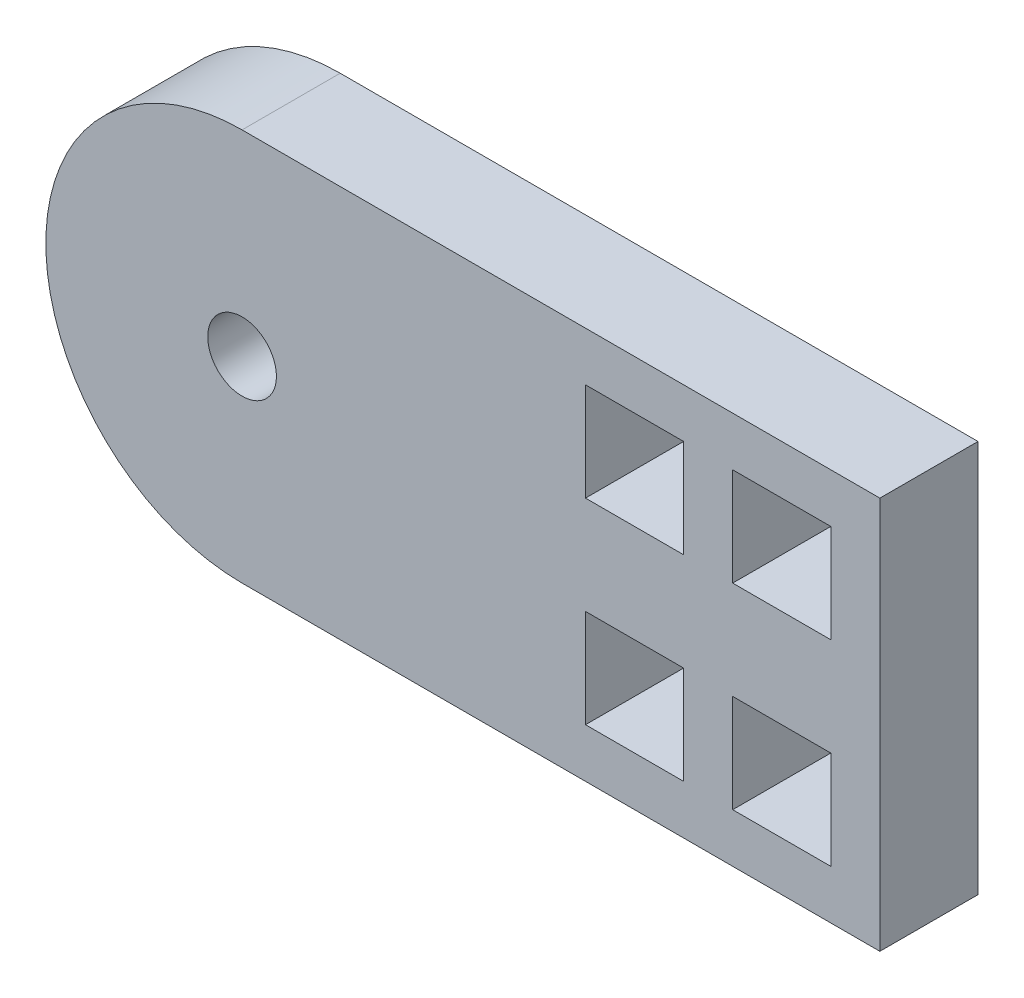
ISO-10303-21;
HEADER;
FILE_DESCRIPTION(('STEP AP214'),'2;1');
FILE_NAME('part.step','',(''),(''),'','','');
FILE_SCHEMA(('AUTOMOTIVE_DESIGN { 1 0 10303 214 1 1 1 1 }'));
ENDSEC;
DATA;
#1=APPLICATION_CONTEXT('core data for automotive mechanical design processes');
#2=APPLICATION_PROTOCOL_DEFINITION('international standard','automotive_design',2000,#1);
#3=PRODUCT_CONTEXT('',#1,'mechanical');
#4=PRODUCT('Part','Part','',(#3));
#5=PRODUCT_RELATED_PRODUCT_CATEGORY('part','',(#4));
#6=PRODUCT_DEFINITION_FORMATION('','',#4);
#7=PRODUCT_DEFINITION_CONTEXT('part definition',#1,'design');
#8=PRODUCT_DEFINITION('design','',#6,#7);
#9=PRODUCT_DEFINITION_SHAPE('','',#8);
#10=(LENGTH_UNIT() NAMED_UNIT(*) SI_UNIT(.MILLI.,.METRE.));
#11=(NAMED_UNIT(*) PLANE_ANGLE_UNIT() SI_UNIT($,.RADIAN.));
#12=(NAMED_UNIT(*) SI_UNIT($,.STERADIAN.) SOLID_ANGLE_UNIT());
#13=UNCERTAINTY_MEASURE_WITH_UNIT(LENGTH_MEASURE(1.E-05),#10,'distance_accuracy_value','');
#14=(GEOMETRIC_REPRESENTATION_CONTEXT(3) GLOBAL_UNCERTAINTY_ASSIGNED_CONTEXT((#13)) GLOBAL_UNIT_ASSIGNED_CONTEXT((#10,
#11,#12)) REPRESENTATION_CONTEXT('',''));
#15=CARTESIAN_POINT('',(0.,0.,0.));
#16=DIRECTION('',(0.,0.,1.));
#17=DIRECTION('',(1.,0.,0.));
#18=AXIS2_PLACEMENT_3D('',#15,#16,#17);
#19=CARTESIAN_POINT('',(0.,0.,5.));
#20=DIRECTION('',(0.,0.,1.));
#21=DIRECTION('',(1.,0.,0.));
#22=AXIS2_PLACEMENT_3D('',#19,#20,#21);
#23=PLANE('',#22);
#24=CARTESIAN_POINT('',(0.,0.,5.));
#25=DIRECTION('',(0.,0.,1.));
#26=DIRECTION('',(1.,0.,0.));
#27=AXIS2_PLACEMENT_3D('',#24,#25,#26);
#28=CIRCLE('',#27,10.);
#29=CARTESIAN_POINT('',(0.,10.,5.));
#30=VERTEX_POINT('',#29);
#31=CARTESIAN_POINT('',(0.,-10.,5.));
#32=VERTEX_POINT('',#31);
#33=EDGE_CURVE('E307',#30,#32,#28,.T.);
#34=ORIENTED_EDGE('',*,*,#33,.T.);
#35=DIRECTION('',(1.,0.,0.));
#36=VECTOR('',#35,1.);
#37=CARTESIAN_POINT('',(0.,-10.,5.));
#38=LINE('',#37,#36);
#39=CARTESIAN_POINT('',(32.5,-10.,5.));
#40=VERTEX_POINT('',#39);
#41=EDGE_CURVE('E310',#32,#40,#38,.T.);
#42=ORIENTED_EDGE('',*,*,#41,.T.);
#43=DIRECTION('',(0.,1.,0.));
#44=VECTOR('',#43,1.);
#45=CARTESIAN_POINT('',(32.5,10.,5.));
#46=LINE('',#45,#44);
#47=CARTESIAN_POINT('',(32.5,10.,5.));
#48=VERTEX_POINT('',#47);
#49=EDGE_CURVE('E313',#40,#48,#46,.T.);
#50=ORIENTED_EDGE('',*,*,#49,.T.);
#51=DIRECTION('',(-1.,0.,0.));
#52=VECTOR('',#51,1.);
#53=CARTESIAN_POINT('',(0.,10.,5.));
#54=LINE('',#53,#52);
#55=EDGE_CURVE('E315',#48,#30,#54,.T.);
#56=ORIENTED_EDGE('',*,*,#55,.T.);
#57=EDGE_LOOP('',(#34,#42,#50,#56));
#58=FACE_BOUND('',#57,.T.);
#59=CARTESIAN_POINT('',(0.,0.,5.));
#60=DIRECTION('',(0.,0.,1.));
#61=DIRECTION('',(1.,0.,0.));
#62=AXIS2_PLACEMENT_3D('',#59,#60,#61);
#63=CIRCLE('',#62,1.75);
#64=CARTESIAN_POINT('',(1.75,0.,5.));
#65=VERTEX_POINT('',#64);
#66=EDGE_CURVE('E301',#65,#65,#63,.T.);
#67=ORIENTED_EDGE('',*,*,#66,.F.);
#68=EDGE_LOOP('',(#67));
#69=FACE_BOUND('',#68,.T.);
#70=DIRECTION('',(-1.,0.,0.));
#71=VECTOR('',#70,1.);
#72=CARTESIAN_POINT('',(25.,7.5,5.));
#73=LINE('',#72,#71);
#74=CARTESIAN_POINT('',(30.,7.5,5.));
#75=VERTEX_POINT('',#74);
#76=CARTESIAN_POINT('',(25.,7.5,5.));
#77=VERTEX_POINT('',#76);
#78=EDGE_CURVE('E272',#75,#77,#73,.T.);
#79=ORIENTED_EDGE('',*,*,#78,.F.);
#80=DIRECTION('',(0.,1.,0.));
#81=VECTOR('',#80,1.);
#82=CARTESIAN_POINT('',(30.,7.5,5.));
#83=LINE('',#82,#81);
#84=CARTESIAN_POINT('',(30.,2.5,5.));
#85=VERTEX_POINT('',#84);
#86=EDGE_CURVE('E270',#85,#75,#83,.T.);
#87=ORIENTED_EDGE('',*,*,#86,.F.);
#88=DIRECTION('',(1.,0.,0.));
#89=VECTOR('',#88,1.);
#90=CARTESIAN_POINT('',(25.,2.5,5.));
#91=LINE('',#90,#89);
#92=CARTESIAN_POINT('',(25.,2.5,5.));
#93=VERTEX_POINT('',#92);
#94=EDGE_CURVE('E278',#93,#85,#91,.T.);
#95=ORIENTED_EDGE('',*,*,#94,.F.);
#96=DIRECTION('',(0.,-1.,0.));
#97=VECTOR('',#96,1.);
#98=CARTESIAN_POINT('',(25.,7.5,5.));
#99=LINE('',#98,#97);
#100=EDGE_CURVE('E275',#77,#93,#99,.T.);
#101=ORIENTED_EDGE('',*,*,#100,.F.);
#102=EDGE_LOOP('',(#79,#87,#95,#101));
#103=FACE_BOUND('',#102,.T.);
#104=DIRECTION('',(-1.,0.,0.));
#105=VECTOR('',#104,1.);
#106=CARTESIAN_POINT('',(25.,-2.5,5.));
#107=LINE('',#106,#105);
#108=CARTESIAN_POINT('',(30.,-2.5,5.));
#109=VERTEX_POINT('',#108);
#110=CARTESIAN_POINT('',(25.,-2.5,5.));
#111=VERTEX_POINT('',#110);
#112=EDGE_CURVE('E241',#109,#111,#107,.T.);
#113=ORIENTED_EDGE('',*,*,#112,.F.);
#114=DIRECTION('',(0.,1.,0.));
#115=VECTOR('',#114,1.);
#116=CARTESIAN_POINT('',(30.,-2.5,5.));
#117=LINE('',#116,#115);
#118=CARTESIAN_POINT('',(30.,-7.5,5.));
#119=VERTEX_POINT('',#118);
#120=EDGE_CURVE('E239',#119,#109,#117,.T.);
#121=ORIENTED_EDGE('',*,*,#120,.F.);
#122=DIRECTION('',(1.,0.,0.));
#123=VECTOR('',#122,1.);
#124=CARTESIAN_POINT('',(25.,-7.5,5.));
#125=LINE('',#124,#123);
#126=CARTESIAN_POINT('',(25.,-7.5,5.));
#127=VERTEX_POINT('',#126);
#128=EDGE_CURVE('E247',#127,#119,#125,.T.);
#129=ORIENTED_EDGE('',*,*,#128,.F.);
#130=DIRECTION('',(0.,-1.,0.));
#131=VECTOR('',#130,1.);
#132=CARTESIAN_POINT('',(25.,-2.5,5.));
#133=LINE('',#132,#131);
#134=EDGE_CURVE('E244',#111,#127,#133,.T.);
#135=ORIENTED_EDGE('',*,*,#134,.F.);
#136=EDGE_LOOP('',(#113,#121,#129,#135));
#137=FACE_BOUND('',#136,.T.);
#138=DIRECTION('',(-1.,0.,0.));
#139=VECTOR('',#138,1.);
#140=CARTESIAN_POINT('',(17.5,-2.5,5.));
#141=LINE('',#140,#139);
#142=CARTESIAN_POINT('',(22.5,-2.5,5.));
#143=VERTEX_POINT('',#142);
#144=CARTESIAN_POINT('',(17.5,-2.5,5.));
#145=VERTEX_POINT('',#144);
#146=EDGE_CURVE('E210',#143,#145,#141,.T.);
#147=ORIENTED_EDGE('',*,*,#146,.F.);
#148=DIRECTION('',(0.,1.,0.));
#149=VECTOR('',#148,1.);
#150=CARTESIAN_POINT('',(22.5,-2.5,5.));
#151=LINE('',#150,#149);
#152=CARTESIAN_POINT('',(22.5,-7.5,5.));
#153=VERTEX_POINT('',#152);
#154=EDGE_CURVE('E208',#153,#143,#151,.T.);
#155=ORIENTED_EDGE('',*,*,#154,.F.);
#156=DIRECTION('',(1.,0.,0.));
#157=VECTOR('',#156,1.);
#158=CARTESIAN_POINT('',(17.5,-7.5,5.));
#159=LINE('',#158,#157);
#160=CARTESIAN_POINT('',(17.5,-7.5,5.));
#161=VERTEX_POINT('',#160);
#162=EDGE_CURVE('E216',#161,#153,#159,.T.);
#163=ORIENTED_EDGE('',*,*,#162,.F.);
#164=DIRECTION('',(0.,-1.,0.));
#165=VECTOR('',#164,1.);
#166=CARTESIAN_POINT('',(17.5,-2.5,5.));
#167=LINE('',#166,#165);
#168=EDGE_CURVE('E213',#145,#161,#167,.T.);
#169=ORIENTED_EDGE('',*,*,#168,.F.);
#170=EDGE_LOOP('',(#147,#155,#163,#169));
#171=FACE_BOUND('',#170,.T.);
#172=DIRECTION('',(-1.,0.,0.));
#173=VECTOR('',#172,1.);
#174=CARTESIAN_POINT('',(17.5,7.5,5.));
#175=LINE('',#174,#173);
#176=CARTESIAN_POINT('',(22.5,7.5,5.));
#177=VERTEX_POINT('',#176);
#178=CARTESIAN_POINT('',(17.5,7.5,5.));
#179=VERTEX_POINT('',#178);
#180=EDGE_CURVE('E180',#177,#179,#175,.T.);
#181=ORIENTED_EDGE('',*,*,#180,.F.);
#182=DIRECTION('',(0.,1.,0.));
#183=VECTOR('',#182,1.);
#184=CARTESIAN_POINT('',(22.5,7.5,5.));
#185=LINE('',#184,#183);
#186=CARTESIAN_POINT('',(22.5,2.5,5.));
#187=VERTEX_POINT('',#186);
#188=EDGE_CURVE('E172',#187,#177,#185,.T.);
#189=ORIENTED_EDGE('',*,*,#188,.F.);
#190=DIRECTION('',(1.,0.,0.));
#191=VECTOR('',#190,1.);
#192=CARTESIAN_POINT('',(17.5,2.5,5.));
#193=LINE('',#192,#191);
#194=CARTESIAN_POINT('',(17.5,2.5,5.));
#195=VERTEX_POINT('',#194);
#196=EDGE_CURVE('E194',#195,#187,#193,.T.);
#197=ORIENTED_EDGE('',*,*,#196,.F.);
#198=DIRECTION('',(0.,-1.,0.));
#199=VECTOR('',#198,1.);
#200=CARTESIAN_POINT('',(17.5,7.5,5.));
#201=LINE('',#200,#199);
#202=EDGE_CURVE('E192',#179,#195,#201,.T.);
#203=ORIENTED_EDGE('',*,*,#202,.F.);
#204=EDGE_LOOP('',(#181,#189,#197,#203));
#205=FACE_BOUND('',#204,.T.);
#206=ADVANCED_FACE('F35',(#58,#69,#103,#137,#171,#205),#23,.T.);
#207=CARTESIAN_POINT('',(0.,0.,0.));
#208=DIRECTION('',(0.,0.,1.));
#209=DIRECTION('',(1.,0.,0.));
#210=AXIS2_PLACEMENT_3D('',#207,#208,#209);
#211=PLANE('',#210);
#212=DIRECTION('',(0.,1.,0.));
#213=VECTOR('',#212,1.);
#214=CARTESIAN_POINT('',(22.5,-2.5,0.));
#215=LINE('',#214,#213);
#216=CARTESIAN_POINT('',(22.5,-7.5,0.));
#217=VERTEX_POINT('',#216);
#218=CARTESIAN_POINT('',(22.5,-2.5,0.));
#219=VERTEX_POINT('',#218);
#220=EDGE_CURVE('E188',#217,#219,#215,.T.);
#221=ORIENTED_EDGE('',*,*,#220,.T.);
#222=DIRECTION('',(-1.,0.,0.));
#223=VECTOR('',#222,1.);
#224=CARTESIAN_POINT('',(17.5,-2.5,0.));
#225=LINE('',#224,#223);
#226=CARTESIAN_POINT('',(17.5,-2.5,0.));
#227=VERTEX_POINT('',#226);
#228=EDGE_CURVE('E221',#219,#227,#225,.T.);
#229=ORIENTED_EDGE('',*,*,#228,.T.);
#230=DIRECTION('',(0.,-1.,0.));
#231=VECTOR('',#230,1.);
#232=CARTESIAN_POINT('',(17.5,-2.5,0.));
#233=LINE('',#232,#231);
#234=CARTESIAN_POINT('',(17.5,-7.5,0.));
#235=VERTEX_POINT('',#234);
#236=EDGE_CURVE('E224',#227,#235,#233,.T.);
#237=ORIENTED_EDGE('',*,*,#236,.T.);
#238=DIRECTION('',(1.,0.,0.));
#239=VECTOR('',#238,1.);
#240=CARTESIAN_POINT('',(17.5,-7.5,0.));
#241=LINE('',#240,#239);
#242=EDGE_CURVE('E211',#235,#217,#241,.T.);
#243=ORIENTED_EDGE('',*,*,#242,.T.);
#244=EDGE_LOOP('',(#221,#229,#237,#243));
#245=FACE_BOUND('',#244,.T.);
#246=DIRECTION('',(0.,1.,0.));
#247=VECTOR('',#246,1.);
#248=CARTESIAN_POINT('',(30.,7.5,0.));
#249=LINE('',#248,#247);
#250=CARTESIAN_POINT('',(30.,2.5,0.));
#251=VERTEX_POINT('',#250);
#252=CARTESIAN_POINT('',(30.,7.5,0.));
#253=VERTEX_POINT('',#252);
#254=EDGE_CURVE('E269',#251,#253,#249,.T.);
#255=ORIENTED_EDGE('',*,*,#254,.T.);
#256=DIRECTION('',(-1.,0.,0.));
#257=VECTOR('',#256,1.);
#258=CARTESIAN_POINT('',(25.,7.5,0.));
#259=LINE('',#258,#257);
#260=CARTESIAN_POINT('',(25.,7.5,0.));
#261=VERTEX_POINT('',#260);
#262=EDGE_CURVE('E283',#253,#261,#259,.T.);
#263=ORIENTED_EDGE('',*,*,#262,.T.);
#264=DIRECTION('',(0.,-1.,0.));
#265=VECTOR('',#264,1.);
#266=CARTESIAN_POINT('',(25.,7.5,0.));
#267=LINE('',#266,#265);
#268=CARTESIAN_POINT('',(25.,2.5,0.));
#269=VERTEX_POINT('',#268);
#270=EDGE_CURVE('E286',#261,#269,#267,.T.);
#271=ORIENTED_EDGE('',*,*,#270,.T.);
#272=DIRECTION('',(1.,0.,0.));
#273=VECTOR('',#272,1.);
#274=CARTESIAN_POINT('',(25.,2.5,0.));
#275=LINE('',#274,#273);
#276=EDGE_CURVE('E273',#269,#251,#275,.T.);
#277=ORIENTED_EDGE('',*,*,#276,.T.);
#278=EDGE_LOOP('',(#255,#263,#271,#277));
#279=FACE_BOUND('',#278,.T.);
#280=CARTESIAN_POINT('',(0.,0.,0.));
#281=DIRECTION('',(0.,0.,1.));
#282=DIRECTION('',(1.,0.,0.));
#283=AXIS2_PLACEMENT_3D('',#280,#281,#282);
#284=CIRCLE('',#283,10.);
#285=CARTESIAN_POINT('',(0.,10.,0.));
#286=VERTEX_POINT('',#285);
#287=CARTESIAN_POINT('',(0.,-10.,0.));
#288=VERTEX_POINT('',#287);
#289=EDGE_CURVE('E304',#286,#288,#284,.T.);
#290=ORIENTED_EDGE('',*,*,#289,.F.);
#291=DIRECTION('',(-1.,0.,0.));
#292=VECTOR('',#291,1.);
#293=CARTESIAN_POINT('',(0.,10.,0.));
#294=LINE('',#293,#292);
#295=CARTESIAN_POINT('',(32.5,10.,0.));
#296=VERTEX_POINT('',#295);
#297=EDGE_CURVE('E311',#296,#286,#294,.T.);
#298=ORIENTED_EDGE('',*,*,#297,.F.);
#299=DIRECTION('',(0.,1.,0.));
#300=VECTOR('',#299,1.);
#301=CARTESIAN_POINT('',(32.5,10.,0.));
#302=LINE('',#301,#300);
#303=CARTESIAN_POINT('',(32.5,-10.,0.));
#304=VERTEX_POINT('',#303);
#305=EDGE_CURVE('E322',#304,#296,#302,.T.);
#306=ORIENTED_EDGE('',*,*,#305,.F.);
#307=DIRECTION('',(1.,0.,0.));
#308=VECTOR('',#307,1.);
#309=CARTESIAN_POINT('',(0.,-10.,0.));
#310=LINE('',#309,#308);
#311=EDGE_CURVE('E320',#288,#304,#310,.T.);
#312=ORIENTED_EDGE('',*,*,#311,.F.);
#313=EDGE_LOOP('',(#290,#298,#306,#312));
#314=FACE_BOUND('',#313,.T.);
#315=CARTESIAN_POINT('',(0.,0.,0.));
#316=DIRECTION('',(0.,0.,1.));
#317=DIRECTION('',(1.,0.,0.));
#318=AXIS2_PLACEMENT_3D('',#315,#316,#317);
#319=CIRCLE('',#318,1.75);
#320=CARTESIAN_POINT('',(1.75,0.,0.));
#321=VERTEX_POINT('',#320);
#322=EDGE_CURVE('E300',#321,#321,#319,.T.);
#323=ORIENTED_EDGE('',*,*,#322,.T.);
#324=EDGE_LOOP('',(#323));
#325=FACE_BOUND('',#324,.T.);
#326=DIRECTION('',(0.,1.,0.));
#327=VECTOR('',#326,1.);
#328=CARTESIAN_POINT('',(30.,-2.5,0.));
#329=LINE('',#328,#327);
#330=CARTESIAN_POINT('',(30.,-7.5,0.));
#331=VERTEX_POINT('',#330);
#332=CARTESIAN_POINT('',(30.,-2.5,0.));
#333=VERTEX_POINT('',#332);
#334=EDGE_CURVE('E238',#331,#333,#329,.T.);
#335=ORIENTED_EDGE('',*,*,#334,.T.);
#336=DIRECTION('',(-1.,0.,0.));
#337=VECTOR('',#336,1.);
#338=CARTESIAN_POINT('',(25.,-2.5,0.));
#339=LINE('',#338,#337);
#340=CARTESIAN_POINT('',(25.,-2.5,0.));
#341=VERTEX_POINT('',#340);
#342=EDGE_CURVE('E252',#333,#341,#339,.T.);
#343=ORIENTED_EDGE('',*,*,#342,.T.);
#344=DIRECTION('',(0.,-1.,0.));
#345=VECTOR('',#344,1.);
#346=CARTESIAN_POINT('',(25.,-2.5,0.));
#347=LINE('',#346,#345);
#348=CARTESIAN_POINT('',(25.,-7.5,0.));
#349=VERTEX_POINT('',#348);
#350=EDGE_CURVE('E255',#341,#349,#347,.T.);
#351=ORIENTED_EDGE('',*,*,#350,.T.);
#352=DIRECTION('',(1.,0.,0.));
#353=VECTOR('',#352,1.);
#354=CARTESIAN_POINT('',(25.,-7.5,0.));
#355=LINE('',#354,#353);
#356=EDGE_CURVE('E242',#349,#331,#355,.T.);
#357=ORIENTED_EDGE('',*,*,#356,.T.);
#358=EDGE_LOOP('',(#335,#343,#351,#357));
#359=FACE_BOUND('',#358,.T.);
#360=DIRECTION('',(0.,1.,0.));
#361=VECTOR('',#360,1.);
#362=CARTESIAN_POINT('',(22.5,7.5,0.));
#363=LINE('',#362,#361);
#364=CARTESIAN_POINT('',(22.5,2.5,0.));
#365=VERTEX_POINT('',#364);
#366=CARTESIAN_POINT('',(22.5,7.5,0.));
#367=VERTEX_POINT('',#366);
#368=EDGE_CURVE('E58',#365,#367,#363,.T.);
#369=ORIENTED_EDGE('',*,*,#368,.T.);
#370=DIRECTION('',(-1.,0.,0.));
#371=VECTOR('',#370,1.);
#372=CARTESIAN_POINT('',(17.5,7.5,0.));
#373=LINE('',#372,#371);
#374=CARTESIAN_POINT('',(17.5,7.5,0.));
#375=VERTEX_POINT('',#374);
#376=EDGE_CURVE('E187',#367,#375,#373,.T.);
#377=ORIENTED_EDGE('',*,*,#376,.T.);
#378=DIRECTION('',(0.,-1.,0.));
#379=VECTOR('',#378,1.);
#380=CARTESIAN_POINT('',(17.5,7.5,0.));
#381=LINE('',#380,#379);
#382=CARTESIAN_POINT('',(17.5,2.5,0.));
#383=VERTEX_POINT('',#382);
#384=EDGE_CURVE('E200',#375,#383,#381,.T.);
#385=ORIENTED_EDGE('',*,*,#384,.T.);
#386=DIRECTION('',(1.,0.,0.));
#387=VECTOR('',#386,1.);
#388=CARTESIAN_POINT('',(17.5,2.5,0.));
#389=LINE('',#388,#387);
#390=EDGE_CURVE('E181',#383,#365,#389,.T.);
#391=ORIENTED_EDGE('',*,*,#390,.T.);
#392=EDGE_LOOP('',(#369,#377,#385,#391));
#393=FACE_BOUND('',#392,.T.);
#394=ADVANCED_FACE('F340',(#245,#279,#314,#325,#359,#393),#211,.F.);
#395=CARTESIAN_POINT('',(0.,0.,5.));
#396=DIRECTION('',(0.,0.,-1.));
#397=DIRECTION('',(-1.,0.,0.));
#398=AXIS2_PLACEMENT_3D('',#395,#396,#397);
#399=CYLINDRICAL_SURFACE('',#398,10.);
#400=ORIENTED_EDGE('',*,*,#289,.T.);
#401=DIRECTION('',(0.,0.,-1.));
#402=VECTOR('',#401,1.);
#403=CARTESIAN_POINT('',(0.,-10.,5.));
#404=LINE('',#403,#402);
#405=EDGE_CURVE('E11',#32,#288,#404,.T.);
#406=ORIENTED_EDGE('',*,*,#405,.F.);
#407=ORIENTED_EDGE('',*,*,#33,.F.);
#408=DIRECTION('',(0.,0.,-1.));
#409=VECTOR('',#408,1.);
#410=CARTESIAN_POINT('',(0.,10.,5.));
#411=LINE('',#410,#409);
#412=EDGE_CURVE('E317',#30,#286,#411,.T.);
#413=ORIENTED_EDGE('',*,*,#412,.T.);
#414=EDGE_LOOP('',(#400,#406,#407,#413));
#415=FACE_BOUND('',#414,.T.);
#416=ADVANCED_FACE('F37',(#415),#399,.T.);
#417=CARTESIAN_POINT('',(0.,-10.,5.));
#418=DIRECTION('',(0.,1.,0.));
#419=DIRECTION('',(0.,0.,1.));
#420=AXIS2_PLACEMENT_3D('',#417,#418,#419);
#421=PLANE('',#420);
#422=ORIENTED_EDGE('',*,*,#311,.T.);
#423=DIRECTION('',(0.,0.,-1.));
#424=VECTOR('',#423,1.);
#425=CARTESIAN_POINT('',(32.5,-10.,5.));
#426=LINE('',#425,#424);
#427=EDGE_CURVE('E43',#40,#304,#426,.T.);
#428=ORIENTED_EDGE('',*,*,#427,.F.);
#429=ORIENTED_EDGE('',*,*,#41,.F.);
#430=ORIENTED_EDGE('',*,*,#405,.T.);
#431=EDGE_LOOP('',(#422,#428,#429,#430));
#432=FACE_BOUND('',#431,.T.);
#433=ADVANCED_FACE('F351',(#432),#421,.F.);
#434=CARTESIAN_POINT('',(32.5,10.,5.));
#435=DIRECTION('',(-1.,0.,0.));
#436=DIRECTION('',(0.,0.,1.));
#437=AXIS2_PLACEMENT_3D('',#434,#435,#436);
#438=PLANE('',#437);
#439=ORIENTED_EDGE('',*,*,#305,.T.);
#440=DIRECTION('',(0.,0.,-1.));
#441=VECTOR('',#440,1.);
#442=CARTESIAN_POINT('',(32.5,10.,5.));
#443=LINE('',#442,#441);
#444=EDGE_CURVE('E327',#48,#296,#443,.T.);
#445=ORIENTED_EDGE('',*,*,#444,.F.);
#446=ORIENTED_EDGE('',*,*,#49,.F.);
#447=ORIENTED_EDGE('',*,*,#427,.T.);
#448=EDGE_LOOP('',(#439,#445,#446,#447));
#449=FACE_BOUND('',#448,.T.);
#450=ADVANCED_FACE('F334',(#449),#438,.F.);
#451=CARTESIAN_POINT('',(0.,10.,5.));
#452=DIRECTION('',(0.,-1.,0.));
#453=DIRECTION('',(1.,0.,0.));
#454=AXIS2_PLACEMENT_3D('',#451,#452,#453);
#455=PLANE('',#454);
#456=ORIENTED_EDGE('',*,*,#297,.T.);
#457=ORIENTED_EDGE('',*,*,#412,.F.);
#458=ORIENTED_EDGE('',*,*,#55,.F.);
#459=ORIENTED_EDGE('',*,*,#444,.T.);
#460=EDGE_LOOP('',(#456,#457,#458,#459));
#461=FACE_BOUND('',#460,.T.);
#462=ADVANCED_FACE('F344',(#461),#455,.F.);
#463=CARTESIAN_POINT('',(0.,0.,5.));
#464=DIRECTION('',(0.,0.,-1.));
#465=DIRECTION('',(-1.,0.,0.));
#466=AXIS2_PLACEMENT_3D('',#463,#464,#465);
#467=CYLINDRICAL_SURFACE('',#466,1.75);
#468=ORIENTED_EDGE('',*,*,#66,.T.);
#469=EDGE_LOOP('',(#468));
#470=FACE_BOUND('',#469,.T.);
#471=ORIENTED_EDGE('',*,*,#322,.F.);
#472=EDGE_LOOP('',(#471));
#473=FACE_BOUND('',#472,.T.);
#474=ADVANCED_FACE('F366',(#470,#473),#467,.F.);
#475=CARTESIAN_POINT('',(30.,7.5,5.));
#476=DIRECTION('',(-1.,0.,0.));
#477=DIRECTION('',(0.,-1.,0.));
#478=AXIS2_PLACEMENT_3D('',#475,#476,#477);
#479=PLANE('',#478);
#480=ORIENTED_EDGE('',*,*,#254,.F.);
#481=DIRECTION('',(0.,0.,-1.));
#482=VECTOR('',#481,1.);
#483=CARTESIAN_POINT('',(30.,2.5,5.));
#484=LINE('',#483,#482);
#485=EDGE_CURVE('E280',#85,#251,#484,.T.);
#486=ORIENTED_EDGE('',*,*,#485,.F.);
#487=ORIENTED_EDGE('',*,*,#86,.T.);
#488=DIRECTION('',(0.,0.,-1.));
#489=VECTOR('',#488,1.);
#490=CARTESIAN_POINT('',(30.,7.5,5.));
#491=LINE('',#490,#489);
#492=EDGE_CURVE('E297',#75,#253,#491,.T.);
#493=ORIENTED_EDGE('',*,*,#492,.T.);
#494=EDGE_LOOP('',(#480,#486,#487,#493));
#495=FACE_BOUND('',#494,.T.);
#496=ADVANCED_FACE('F373',(#495),#479,.T.);
#497=CARTESIAN_POINT('',(25.,7.5,5.));
#498=DIRECTION('',(0.,-1.,0.));
#499=DIRECTION('',(0.,0.,-1.));
#500=AXIS2_PLACEMENT_3D('',#497,#498,#499);
#501=PLANE('',#500);
#502=ORIENTED_EDGE('',*,*,#262,.F.);
#503=ORIENTED_EDGE('',*,*,#492,.F.);
#504=ORIENTED_EDGE('',*,*,#78,.T.);
#505=DIRECTION('',(0.,0.,-1.));
#506=VECTOR('',#505,1.);
#507=CARTESIAN_POINT('',(25.,7.5,5.));
#508=LINE('',#507,#506);
#509=EDGE_CURVE('E295',#77,#261,#508,.T.);
#510=ORIENTED_EDGE('',*,*,#509,.T.);
#511=EDGE_LOOP('',(#502,#503,#504,#510));
#512=FACE_BOUND('',#511,.T.);
#513=ADVANCED_FACE('F378',(#512),#501,.T.);
#514=CARTESIAN_POINT('',(25.,7.5,5.));
#515=DIRECTION('',(1.,0.,0.));
#516=DIRECTION('',(0.,0.,-1.));
#517=AXIS2_PLACEMENT_3D('',#514,#515,#516);
#518=PLANE('',#517);
#519=ORIENTED_EDGE('',*,*,#270,.F.);
#520=ORIENTED_EDGE('',*,*,#509,.F.);
#521=ORIENTED_EDGE('',*,*,#100,.T.);
#522=DIRECTION('',(0.,0.,-1.));
#523=VECTOR('',#522,1.);
#524=CARTESIAN_POINT('',(25.,2.5,5.));
#525=LINE('',#524,#523);
#526=EDGE_CURVE('E293',#93,#269,#525,.T.);
#527=ORIENTED_EDGE('',*,*,#526,.T.);
#528=EDGE_LOOP('',(#519,#520,#521,#527));
#529=FACE_BOUND('',#528,.T.);
#530=ADVANCED_FACE('F435',(#529),#518,.T.);
#531=CARTESIAN_POINT('',(25.,2.5,5.));
#532=DIRECTION('',(0.,1.,0.));
#533=DIRECTION('',(-1.,0.,0.));
#534=AXIS2_PLACEMENT_3D('',#531,#532,#533);
#535=PLANE('',#534);
#536=ORIENTED_EDGE('',*,*,#276,.F.);
#537=ORIENTED_EDGE('',*,*,#526,.F.);
#538=ORIENTED_EDGE('',*,*,#94,.T.);
#539=ORIENTED_EDGE('',*,*,#485,.T.);
#540=EDGE_LOOP('',(#536,#537,#538,#539));
#541=FACE_BOUND('',#540,.T.);
#542=ADVANCED_FACE('F431',(#541),#535,.T.);
#543=CARTESIAN_POINT('',(30.,-2.5,5.));
#544=DIRECTION('',(-1.,0.,0.));
#545=DIRECTION('',(0.,0.,1.));
#546=AXIS2_PLACEMENT_3D('',#543,#544,#545);
#547=PLANE('',#546);
#548=ORIENTED_EDGE('',*,*,#334,.F.);
#549=DIRECTION('',(0.,0.,-1.));
#550=VECTOR('',#549,1.);
#551=CARTESIAN_POINT('',(30.,-7.5,5.));
#552=LINE('',#551,#550);
#553=EDGE_CURVE('E249',#119,#331,#552,.T.);
#554=ORIENTED_EDGE('',*,*,#553,.F.);
#555=ORIENTED_EDGE('',*,*,#120,.T.);
#556=DIRECTION('',(0.,0.,-1.));
#557=VECTOR('',#556,1.);
#558=CARTESIAN_POINT('',(30.,-2.5,5.));
#559=LINE('',#558,#557);
#560=EDGE_CURVE('E266',#109,#333,#559,.T.);
#561=ORIENTED_EDGE('',*,*,#560,.T.);
#562=EDGE_LOOP('',(#548,#554,#555,#561));
#563=FACE_BOUND('',#562,.T.);
#564=ADVANCED_FACE('F427',(#563),#547,.T.);
#565=CARTESIAN_POINT('',(25.,-2.5,5.));
#566=DIRECTION('',(0.,-1.,0.));
#567=DIRECTION('',(0.,0.,-1.));
#568=AXIS2_PLACEMENT_3D('',#565,#566,#567);
#569=PLANE('',#568);
#570=ORIENTED_EDGE('',*,*,#342,.F.);
#571=ORIENTED_EDGE('',*,*,#560,.F.);
#572=ORIENTED_EDGE('',*,*,#112,.T.);
#573=DIRECTION('',(0.,0.,-1.));
#574=VECTOR('',#573,1.);
#575=CARTESIAN_POINT('',(25.,-2.5,5.));
#576=LINE('',#575,#574);
#577=EDGE_CURVE('E264',#111,#341,#576,.T.);
#578=ORIENTED_EDGE('',*,*,#577,.T.);
#579=EDGE_LOOP('',(#570,#571,#572,#578));
#580=FACE_BOUND('',#579,.T.);
#581=ADVANCED_FACE('F423',(#580),#569,.T.);
#582=CARTESIAN_POINT('',(25.,-2.5,5.));
#583=DIRECTION('',(1.,0.,0.));
#584=DIRECTION('',(0.,0.,-1.));
#585=AXIS2_PLACEMENT_3D('',#582,#583,#584);
#586=PLANE('',#585);
#587=ORIENTED_EDGE('',*,*,#350,.F.);
#588=ORIENTED_EDGE('',*,*,#577,.F.);
#589=ORIENTED_EDGE('',*,*,#134,.T.);
#590=DIRECTION('',(0.,0.,-1.));
#591=VECTOR('',#590,1.);
#592=CARTESIAN_POINT('',(25.,-7.5,5.));
#593=LINE('',#592,#591);
#594=EDGE_CURVE('E262',#127,#349,#593,.T.);
#595=ORIENTED_EDGE('',*,*,#594,.T.);
#596=EDGE_LOOP('',(#587,#588,#589,#595));
#597=FACE_BOUND('',#596,.T.);
#598=ADVANCED_FACE('F419',(#597),#586,.T.);
#599=CARTESIAN_POINT('',(25.,-7.5,5.));
#600=DIRECTION('',(0.,1.,0.));
#601=DIRECTION('',(0.,0.,1.));
#602=AXIS2_PLACEMENT_3D('',#599,#600,#601);
#603=PLANE('',#602);
#604=ORIENTED_EDGE('',*,*,#356,.F.);
#605=ORIENTED_EDGE('',*,*,#594,.F.);
#606=ORIENTED_EDGE('',*,*,#128,.T.);
#607=ORIENTED_EDGE('',*,*,#553,.T.);
#608=EDGE_LOOP('',(#604,#605,#606,#607));
#609=FACE_BOUND('',#608,.T.);
#610=ADVANCED_FACE('F415',(#609),#603,.T.);
#611=CARTESIAN_POINT('',(22.5,-2.5,5.));
#612=DIRECTION('',(-1.,0.,0.));
#613=DIRECTION('',(0.,0.,1.));
#614=AXIS2_PLACEMENT_3D('',#611,#612,#613);
#615=PLANE('',#614);
#616=ORIENTED_EDGE('',*,*,#220,.F.);
#617=DIRECTION('',(0.,0.,-1.));
#618=VECTOR('',#617,1.);
#619=CARTESIAN_POINT('',(22.5,-7.5,5.));
#620=LINE('',#619,#618);
#621=EDGE_CURVE('E218',#153,#217,#620,.T.);
#622=ORIENTED_EDGE('',*,*,#621,.F.);
#623=ORIENTED_EDGE('',*,*,#154,.T.);
#624=DIRECTION('',(0.,0.,-1.));
#625=VECTOR('',#624,1.);
#626=CARTESIAN_POINT('',(22.5,-2.5,5.));
#627=LINE('',#626,#625);
#628=EDGE_CURVE('E235',#143,#219,#627,.T.);
#629=ORIENTED_EDGE('',*,*,#628,.T.);
#630=EDGE_LOOP('',(#616,#622,#623,#629));
#631=FACE_BOUND('',#630,.T.);
#632=ADVANCED_FACE('F411',(#631),#615,.T.);
#633=CARTESIAN_POINT('',(17.5,-2.5,5.));
#634=DIRECTION('',(0.,-1.,0.));
#635=DIRECTION('',(0.,0.,-1.));
#636=AXIS2_PLACEMENT_3D('',#633,#634,#635);
#637=PLANE('',#636);
#638=ORIENTED_EDGE('',*,*,#228,.F.);
#639=ORIENTED_EDGE('',*,*,#628,.F.);
#640=ORIENTED_EDGE('',*,*,#146,.T.);
#641=DIRECTION('',(0.,0.,-1.));
#642=VECTOR('',#641,1.);
#643=CARTESIAN_POINT('',(17.5,-2.5,5.));
#644=LINE('',#643,#642);
#645=EDGE_CURVE('E233',#145,#227,#644,.T.);
#646=ORIENTED_EDGE('',*,*,#645,.T.);
#647=EDGE_LOOP('',(#638,#639,#640,#646));
#648=FACE_BOUND('',#647,.T.);
#649=ADVANCED_FACE('F407',(#648),#637,.T.);
#650=CARTESIAN_POINT('',(17.5,-2.5,5.));
#651=DIRECTION('',(1.,0.,0.));
#652=DIRECTION('',(0.,0.,-1.));
#653=AXIS2_PLACEMENT_3D('',#650,#651,#652);
#654=PLANE('',#653);
#655=ORIENTED_EDGE('',*,*,#236,.F.);
#656=ORIENTED_EDGE('',*,*,#645,.F.);
#657=ORIENTED_EDGE('',*,*,#168,.T.);
#658=DIRECTION('',(0.,0.,-1.));
#659=VECTOR('',#658,1.);
#660=CARTESIAN_POINT('',(17.5,-7.5,5.));
#661=LINE('',#660,#659);
#662=EDGE_CURVE('E231',#161,#235,#661,.T.);
#663=ORIENTED_EDGE('',*,*,#662,.T.);
#664=EDGE_LOOP('',(#655,#656,#657,#663));
#665=FACE_BOUND('',#664,.T.);
#666=ADVANCED_FACE('F403',(#665),#654,.T.);
#667=CARTESIAN_POINT('',(17.5,-7.5,5.));
#668=DIRECTION('',(0.,1.,0.));
#669=DIRECTION('',(0.,0.,1.));
#670=AXIS2_PLACEMENT_3D('',#667,#668,#669);
#671=PLANE('',#670);
#672=ORIENTED_EDGE('',*,*,#242,.F.);
#673=ORIENTED_EDGE('',*,*,#662,.F.);
#674=ORIENTED_EDGE('',*,*,#162,.T.);
#675=ORIENTED_EDGE('',*,*,#621,.T.);
#676=EDGE_LOOP('',(#672,#673,#674,#675));
#677=FACE_BOUND('',#676,.T.);
#678=ADVANCED_FACE('F400',(#677),#671,.T.);
#679=CARTESIAN_POINT('',(22.5,7.5,5.));
#680=DIRECTION('',(-1.,0.,0.));
#681=DIRECTION('',(0.,0.,1.));
#682=AXIS2_PLACEMENT_3D('',#679,#680,#681);
#683=PLANE('',#682);
#684=ORIENTED_EDGE('',*,*,#368,.F.);
#685=DIRECTION('',(0.,0.,-1.));
#686=VECTOR('',#685,1.);
#687=CARTESIAN_POINT('',(22.5,2.5,5.));
#688=LINE('',#687,#686);
#689=EDGE_CURVE('E176',#187,#365,#688,.T.);
#690=ORIENTED_EDGE('',*,*,#689,.F.);
#691=ORIENTED_EDGE('',*,*,#188,.T.);
#692=DIRECTION('',(0.,0.,-1.));
#693=VECTOR('',#692,1.);
#694=CARTESIAN_POINT('',(22.5,7.5,5.));
#695=LINE('',#694,#693);
#696=EDGE_CURVE('E175',#177,#367,#695,.T.);
#697=ORIENTED_EDGE('',*,*,#696,.T.);
#698=EDGE_LOOP('',(#684,#690,#691,#697));
#699=FACE_BOUND('',#698,.T.);
#700=ADVANCED_FACE('F174',(#699),#683,.T.);
#701=CARTESIAN_POINT('',(17.5,7.5,5.));
#702=DIRECTION('',(0.,-1.,0.));
#703=DIRECTION('',(0.,0.,-1.));
#704=AXIS2_PLACEMENT_3D('',#701,#702,#703);
#705=PLANE('',#704);
#706=ORIENTED_EDGE('',*,*,#376,.F.);
#707=ORIENTED_EDGE('',*,*,#696,.F.);
#708=ORIENTED_EDGE('',*,*,#180,.T.);
#709=DIRECTION('',(0.,0.,-1.));
#710=VECTOR('',#709,1.);
#711=CARTESIAN_POINT('',(17.5,7.5,5.));
#712=LINE('',#711,#710);
#713=EDGE_CURVE('E189',#179,#375,#712,.T.);
#714=ORIENTED_EDGE('',*,*,#713,.T.);
#715=EDGE_LOOP('',(#706,#707,#708,#714));
#716=FACE_BOUND('',#715,.T.);
#717=ADVANCED_FACE('F184',(#716),#705,.T.);
#718=CARTESIAN_POINT('',(17.5,7.5,5.));
#719=DIRECTION('',(1.,0.,0.));
#720=DIRECTION('',(0.,0.,-1.));
#721=AXIS2_PLACEMENT_3D('',#718,#719,#720);
#722=PLANE('',#721);
#723=ORIENTED_EDGE('',*,*,#384,.F.);
#724=ORIENTED_EDGE('',*,*,#713,.F.);
#725=ORIENTED_EDGE('',*,*,#202,.T.);
#726=DIRECTION('',(0.,0.,-1.));
#727=VECTOR('',#726,1.);
#728=CARTESIAN_POINT('',(17.5,2.5,5.));
#729=LINE('',#728,#727);
#730=EDGE_CURVE('E50',#195,#383,#729,.T.);
#731=ORIENTED_EDGE('',*,*,#730,.T.);
#732=EDGE_LOOP('',(#723,#724,#725,#731));
#733=FACE_BOUND('',#732,.T.);
#734=ADVANCED_FACE('F388',(#733),#722,.T.);
#735=CARTESIAN_POINT('',(17.5,2.5,5.));
#736=DIRECTION('',(0.,1.,0.));
#737=DIRECTION('',(0.,0.,1.));
#738=AXIS2_PLACEMENT_3D('',#735,#736,#737);
#739=PLANE('',#738);
#740=ORIENTED_EDGE('',*,*,#390,.F.);
#741=ORIENTED_EDGE('',*,*,#730,.F.);
#742=ORIENTED_EDGE('',*,*,#196,.T.);
#743=ORIENTED_EDGE('',*,*,#689,.T.);
#744=EDGE_LOOP('',(#740,#741,#742,#743));
#745=FACE_BOUND('',#744,.T.);
#746=ADVANCED_FACE('F386',(#745),#739,.T.);
#747=CLOSED_SHELL('',(#206,#394,#416,#433,#450,#462,#474,#496,#513,#530,#542,#564,#581,#598,
#610,#632,#649,#666,#678,#700,#717,#734,#746));
#748=MANIFOLD_SOLID_BREP('B2',#747);
#749=ADVANCED_BREP_SHAPE_REPRESENTATION('',(#18,#748),#14);
#750=SHAPE_DEFINITION_REPRESENTATION(#9,#749);
ENDSEC;
END-ISO-10303-21;
